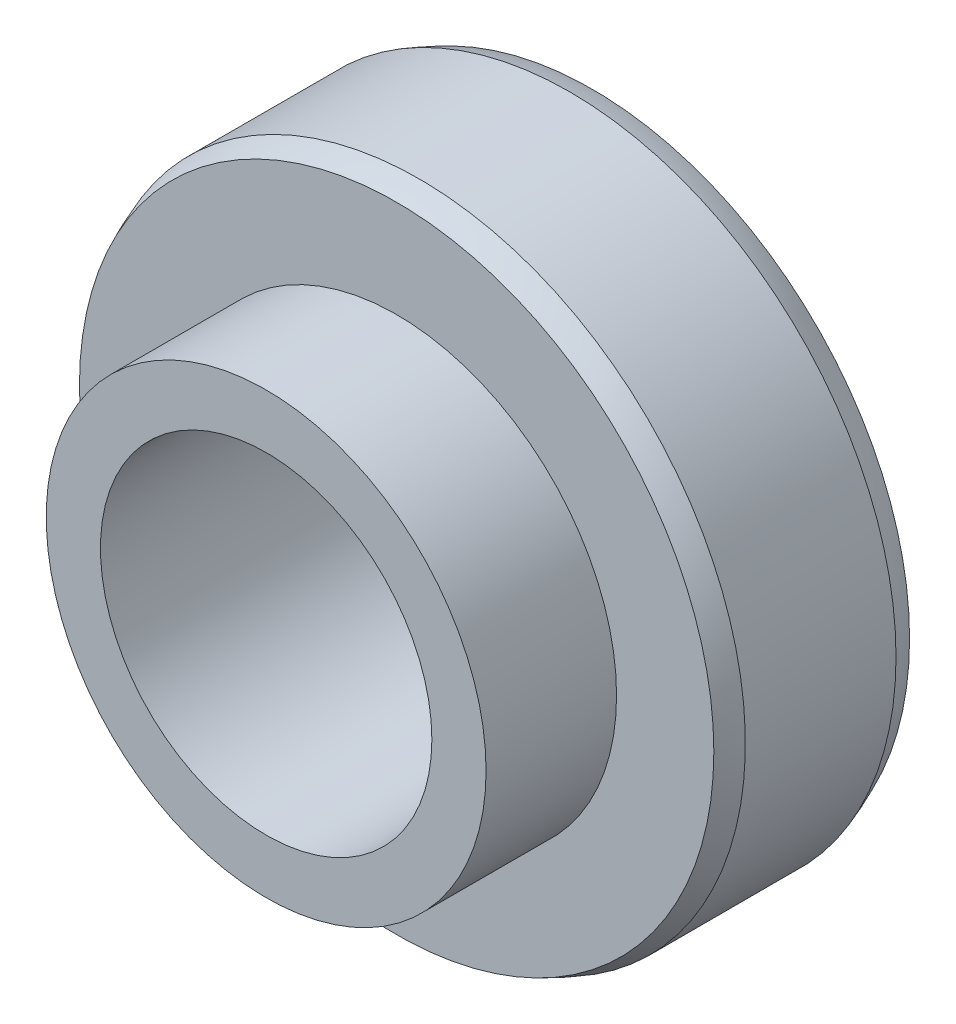
ISO-10303-21;
HEADER;
FILE_DESCRIPTION(('STEP AP214'),'2;1');
FILE_NAME('part.step','',(''),(''),'','','');
FILE_SCHEMA(('AUTOMOTIVE_DESIGN { 1 0 10303 214 1 1 1 1 }'));
ENDSEC;
DATA;
#1=APPLICATION_CONTEXT('core data for automotive mechanical design processes');
#2=APPLICATION_PROTOCOL_DEFINITION('international standard','automotive_design',2000,#1);
#3=PRODUCT_CONTEXT('',#1,'mechanical');
#4=PRODUCT('Part','Part','',(#3));
#5=PRODUCT_RELATED_PRODUCT_CATEGORY('part','',(#4));
#6=PRODUCT_DEFINITION_FORMATION('','',#4);
#7=PRODUCT_DEFINITION_CONTEXT('part definition',#1,'design');
#8=PRODUCT_DEFINITION('design','',#6,#7);
#9=PRODUCT_DEFINITION_SHAPE('','',#8);
#10=(LENGTH_UNIT() NAMED_UNIT(*) SI_UNIT(.MILLI.,.METRE.));
#11=(NAMED_UNIT(*) PLANE_ANGLE_UNIT() SI_UNIT($,.RADIAN.));
#12=(NAMED_UNIT(*) SI_UNIT($,.STERADIAN.) SOLID_ANGLE_UNIT());
#13=UNCERTAINTY_MEASURE_WITH_UNIT(LENGTH_MEASURE(1.E-05),#10,'distance_accuracy_value','');
#14=(GEOMETRIC_REPRESENTATION_CONTEXT(3) GLOBAL_UNCERTAINTY_ASSIGNED_CONTEXT((#13)) GLOBAL_UNIT_ASSIGNED_CONTEXT((#10,
#11,#12)) REPRESENTATION_CONTEXT('',''));
#15=CARTESIAN_POINT('',(0.,0.,0.));
#16=DIRECTION('',(0.,0.,1.));
#17=DIRECTION('',(1.,0.,0.));
#18=AXIS2_PLACEMENT_3D('',#15,#16,#17);
#19=CARTESIAN_POINT('',(0.,0.,15.));
#20=DIRECTION('',(0.,0.,1.));
#21=DIRECTION('',(1.,0.,0.));
#22=AXIS2_PLACEMENT_3D('',#19,#20,#21);
#23=PLANE('',#22);
#24=CARTESIAN_POINT('',(0.,0.,15.));
#25=DIRECTION('',(0.,0.,-1.));
#26=DIRECTION('',(-1.,0.,0.));
#27=AXIS2_PLACEMENT_3D('',#24,#25,#26);
#28=CIRCLE('',#27,24.3112627475197);
#29=CARTESIAN_POINT('',(-24.3112627475197,0.,15.));
#30=VERTEX_POINT('',#29);
#31=EDGE_CURVE('E59',#30,#30,#28,.T.);
#32=ORIENTED_EDGE('',*,*,#31,.F.);
#33=EDGE_LOOP('',(#32));
#34=FACE_BOUND('',#33,.T.);
#35=CARTESIAN_POINT('',(0.,0.,15.));
#36=DIRECTION('',(0.,0.,1.));
#37=DIRECTION('',(1.,0.,0.));
#38=AXIS2_PLACEMENT_3D('',#35,#36,#37);
#39=CIRCLE('',#38,16.855);
#40=CARTESIAN_POINT('',(16.855,0.,15.));
#41=VERTEX_POINT('',#40);
#42=EDGE_CURVE('E36',#41,#41,#39,.T.);
#43=ORIENTED_EDGE('',*,*,#42,.F.);
#44=EDGE_LOOP('',(#43));
#45=FACE_BOUND('',#44,.T.);
#46=ADVANCED_FACE('F32',(#34,#45),#23,.T.);
#47=CARTESIAN_POINT('',(0.,0.,0.));
#48=DIRECTION('',(0.,0.,1.));
#49=DIRECTION('',(1.,0.,0.));
#50=AXIS2_PLACEMENT_3D('',#47,#48,#49);
#51=PLANE('',#50);
#52=CARTESIAN_POINT('',(0.,0.,0.));
#53=DIRECTION('',(0.,0.,-1.));
#54=DIRECTION('',(-1.,0.,0.));
#55=AXIS2_PLACEMENT_3D('',#52,#53,#54);
#56=CIRCLE('',#55,24.3112627475197);
#57=CARTESIAN_POINT('',(-24.3112627475197,0.,0.));
#58=VERTEX_POINT('',#57);
#59=EDGE_CURVE('E56',#58,#58,#56,.T.);
#60=ORIENTED_EDGE('',*,*,#59,.T.);
#61=EDGE_LOOP('',(#60));
#62=FACE_BOUND('',#61,.T.);
#63=CARTESIAN_POINT('',(0.,0.,0.));
#64=DIRECTION('',(0.,0.,1.));
#65=DIRECTION('',(1.,0.,0.));
#66=AXIS2_PLACEMENT_3D('',#63,#64,#65);
#67=CIRCLE('',#66,12.7);
#68=CARTESIAN_POINT('',(12.7,0.,0.));
#69=VERTEX_POINT('',#68);
#70=EDGE_CURVE('E43',#69,#69,#67,.T.);
#71=ORIENTED_EDGE('',*,*,#70,.T.);
#72=EDGE_LOOP('',(#71));
#73=FACE_BOUND('',#72,.T.);
#74=ADVANCED_FACE('F68',(#62,#73),#51,.F.);
#75=CARTESIAN_POINT('',(0.,0.,25.));
#76=DIRECTION('',(0.,0.,-1.));
#77=DIRECTION('',(-1.,0.,0.));
#78=AXIS2_PLACEMENT_3D('',#75,#76,#77);
#79=CYLINDRICAL_SURFACE('',#78,16.855);
#80=CARTESIAN_POINT('',(0.,0.,25.));
#81=DIRECTION('',(0.,0.,1.));
#82=DIRECTION('',(1.,0.,0.));
#83=AXIS2_PLACEMENT_3D('',#80,#81,#82);
#84=CIRCLE('',#83,16.855);
#85=CARTESIAN_POINT('',(16.855,0.,25.));
#86=VERTEX_POINT('',#85);
#87=EDGE_CURVE('E10',#86,#86,#84,.T.);
#88=ORIENTED_EDGE('',*,*,#87,.F.);
#89=EDGE_LOOP('',(#88));
#90=FACE_BOUND('',#89,.T.);
#91=ORIENTED_EDGE('',*,*,#42,.T.);
#92=EDGE_LOOP('',(#91));
#93=FACE_BOUND('',#92,.T.);
#94=ADVANCED_FACE('F72',(#90,#93),#79,.T.);
#95=CARTESIAN_POINT('',(0.,0.,25.));
#96=DIRECTION('',(0.,0.,1.));
#97=DIRECTION('',(1.,0.,0.));
#98=AXIS2_PLACEMENT_3D('',#95,#96,#97);
#99=PLANE('',#98);
#100=CARTESIAN_POINT('',(0.,0.,25.));
#101=DIRECTION('',(0.,0.,1.));
#102=DIRECTION('',(1.,0.,0.));
#103=AXIS2_PLACEMENT_3D('',#100,#101,#102);
#104=CIRCLE('',#103,12.7);
#105=CARTESIAN_POINT('',(12.7,0.,25.));
#106=VERTEX_POINT('',#105);
#107=EDGE_CURVE('E47',#106,#106,#104,.T.);
#108=ORIENTED_EDGE('',*,*,#107,.F.);
#109=EDGE_LOOP('',(#108));
#110=FACE_BOUND('',#109,.T.);
#111=ORIENTED_EDGE('',*,*,#87,.T.);
#112=EDGE_LOOP('',(#111));
#113=FACE_BOUND('',#112,.T.);
#114=ADVANCED_FACE('F74',(#110,#113),#99,.T.);
#115=CARTESIAN_POINT('',(0.,0.,-5.));
#116=DIRECTION('',(0.,0.,1.));
#117=DIRECTION('',(1.,0.,0.));
#118=AXIS2_PLACEMENT_3D('',#115,#116,#117);
#119=CYLINDRICAL_SURFACE('',#118,12.7);
#120=ORIENTED_EDGE('',*,*,#107,.T.);
#121=EDGE_LOOP('',(#120));
#122=FACE_BOUND('',#121,.T.);
#123=ORIENTED_EDGE('',*,*,#70,.F.);
#124=EDGE_LOOP('',(#123));
#125=FACE_BOUND('',#124,.T.);
#126=ADVANCED_FACE('F81',(#122,#125),#119,.F.);
#127=CARTESIAN_POINT('',(0.,0.,7.5));
#128=DIRECTION('',(0.,0.,-1.));
#129=DIRECTION('',(-1.,0.,0.));
#130=AXIS2_PLACEMENT_3D('',#127,#128,#129);
#131=DEGENERATE_TOROIDAL_SURFACE('',#130,8.01366067466252,17.9405081679756,.T.);
#132=ORIENTED_EDGE('',*,*,#59,.F.);
#133=EDGE_LOOP('',(#132));
#134=FACE_BOUND('',#133,.T.);
#135=CARTESIAN_POINT('',(0.,0.,1.72712293135455));
#136=DIRECTION('',(0.,0.,1.));
#137=DIRECTION('',(1.,0.,0.));
#138=AXIS2_PLACEMENT_3D('',#135,#136,#137);
#139=CIRCLE('',#138,25.);
#140=CARTESIAN_POINT('',(25.,0.,1.72712293135455));
#141=VERTEX_POINT('',#140);
#142=EDGE_CURVE('E50',#141,#141,#139,.T.);
#143=ORIENTED_EDGE('',*,*,#142,.F.);
#144=EDGE_LOOP('',(#143));
#145=FACE_BOUND('',#144,.T.);
#146=ADVANCED_FACE('F88',(#134,#145),#131,.T.);
#147=CARTESIAN_POINT('',(0.,0.,15.));
#148=DIRECTION('',(0.,0.,-1.));
#149=DIRECTION('',(-1.,0.,0.));
#150=AXIS2_PLACEMENT_3D('',#147,#148,#149);
#151=CYLINDRICAL_SURFACE('',#150,25.);
#152=ORIENTED_EDGE('',*,*,#142,.T.);
#153=EDGE_LOOP('',(#152));
#154=FACE_BOUND('',#153,.T.);
#155=CARTESIAN_POINT('',(0.,0.,13.2728770686454));
#156=DIRECTION('',(0.,0.,-1.));
#157=DIRECTION('',(-1.,0.,0.));
#158=AXIS2_PLACEMENT_3D('',#155,#156,#157);
#159=CIRCLE('',#158,25.);
#160=CARTESIAN_POINT('',(-25.,0.,13.2728770686454));
#161=VERTEX_POINT('',#160);
#162=EDGE_CURVE('E53',#161,#161,#159,.T.);
#163=ORIENTED_EDGE('',*,*,#162,.T.);
#164=EDGE_LOOP('',(#163));
#165=FACE_BOUND('',#164,.T.);
#166=ADVANCED_FACE('F34',(#154,#165),#151,.T.);
#167=ORIENTED_EDGE('',*,*,#31,.T.);
#168=EDGE_LOOP('',(#167));
#169=FACE_BOUND('',#168,.T.);
#170=ORIENTED_EDGE('',*,*,#162,.F.);
#171=EDGE_LOOP('',(#170));
#172=FACE_BOUND('',#171,.T.);
#173=ADVANCED_FACE('F63',(#169,#172),#131,.T.);
#174=CLOSED_SHELL('',(#46,#74,#94,#114,#126,#146,#166,#173));
#175=MANIFOLD_SOLID_BREP('B2',#174);
#176=ADVANCED_BREP_SHAPE_REPRESENTATION('',(#18,#175),#14);
#177=SHAPE_DEFINITION_REPRESENTATION(#9,#176);
ENDSEC;
END-ISO-10303-21;
